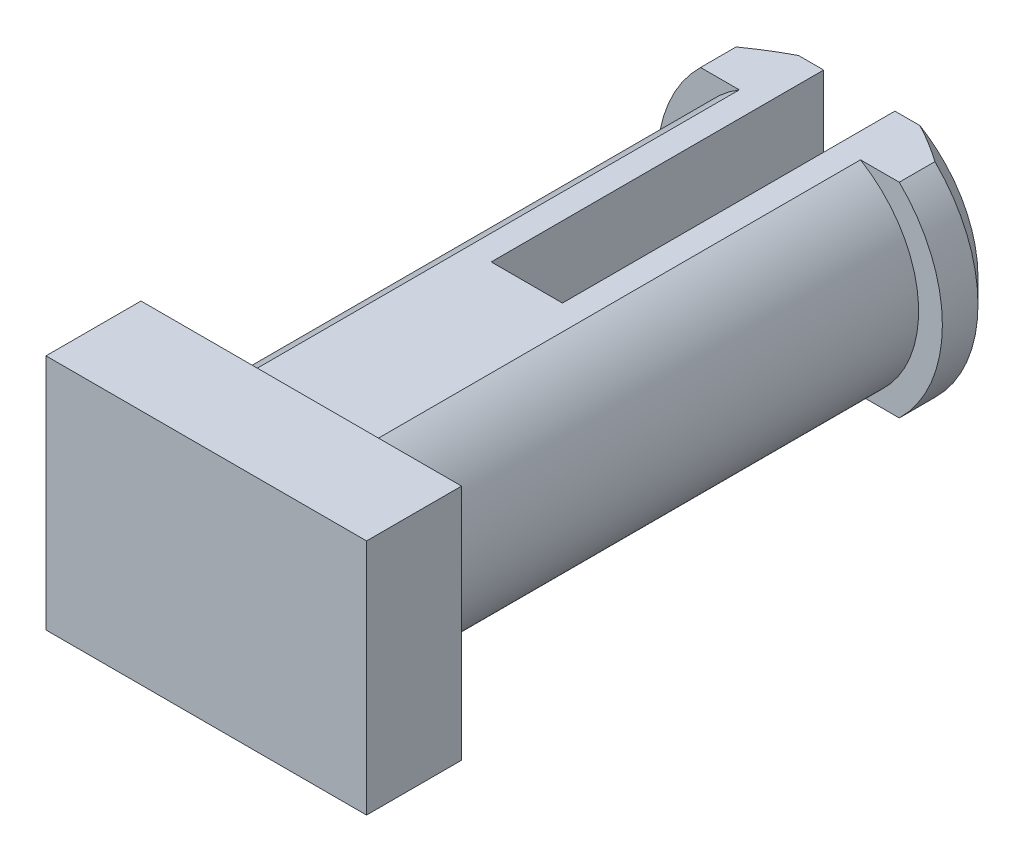
ISO-10303-21;
HEADER;
FILE_DESCRIPTION(('STEP AP214'),'2;1');
FILE_NAME('part.step','',(''),(''),'','','');
FILE_SCHEMA(('AUTOMOTIVE_DESIGN { 1 0 10303 214 1 1 1 1 }'));
ENDSEC;
DATA;
#1=APPLICATION_CONTEXT('core data for automotive mechanical design processes');
#2=APPLICATION_PROTOCOL_DEFINITION('international standard','automotive_design',2000,#1);
#3=PRODUCT_CONTEXT('',#1,'mechanical');
#4=PRODUCT('Part','Part','',(#3));
#5=PRODUCT_RELATED_PRODUCT_CATEGORY('part','',(#4));
#6=PRODUCT_DEFINITION_FORMATION('','',#4);
#7=PRODUCT_DEFINITION_CONTEXT('part definition',#1,'design');
#8=PRODUCT_DEFINITION('design','',#6,#7);
#9=PRODUCT_DEFINITION_SHAPE('','',#8);
#10=(LENGTH_UNIT() NAMED_UNIT(*) SI_UNIT(.MILLI.,.METRE.));
#11=(NAMED_UNIT(*) PLANE_ANGLE_UNIT() SI_UNIT($,.RADIAN.));
#12=(NAMED_UNIT(*) SI_UNIT($,.STERADIAN.) SOLID_ANGLE_UNIT());
#13=UNCERTAINTY_MEASURE_WITH_UNIT(LENGTH_MEASURE(1.E-05),#10,'distance_accuracy_value','');
#14=(GEOMETRIC_REPRESENTATION_CONTEXT(3) GLOBAL_UNCERTAINTY_ASSIGNED_CONTEXT((#13)) GLOBAL_UNIT_ASSIGNED_CONTEXT((#10,
#11,#12)) REPRESENTATION_CONTEXT('',''));
#15=CARTESIAN_POINT('',(0.,0.,0.));
#16=DIRECTION('',(0.,0.,1.));
#17=DIRECTION('',(1.,0.,0.));
#18=AXIS2_PLACEMENT_3D('',#15,#16,#17);
#19=CARTESIAN_POINT('',(-105.21853344578,-4.81752768715062,-14.553562098375));
#20=DIRECTION('',(0.,0.,1.));
#21=DIRECTION('',(1.,0.,0.));
#22=AXIS2_PLACEMENT_3D('',#19,#20,#21);
#23=PLANE('',#22);
#24=DIRECTION('',(0.,1.,0.));
#25=VECTOR('',#24,1.);
#26=CARTESIAN_POINT('',(-104.18353344578,1.90247231284937,-14.553562098375));
#27=LINE('',#26,#25);
#28=CARTESIAN_POINT('',(-104.18353344578,-3.95752768715062,-14.553562098375));
#29=VERTEX_POINT('',#28);
#30=CARTESIAN_POINT('',(-104.18353344578,1.04247231284938,-14.553562098375));
#31=VERTEX_POINT('',#30);
#32=EDGE_CURVE('E242',#29,#31,#27,.T.);
#33=ORIENTED_EDGE('',*,*,#32,.F.);
#34=DIRECTION('',(1.,0.,0.));
#35=VECTOR('',#34,1.);
#36=CARTESIAN_POINT('',(-105.21853344578,-3.95752768715061,-14.553562098375));
#37=LINE('',#36,#35);
#38=CARTESIAN_POINT('',(-97.4335334457796,-3.95752768715061,-14.553562098375));
#39=VERTEX_POINT('',#38);
#40=EDGE_CURVE('E245',#39,#29,#37,.F.);
#41=ORIENTED_EDGE('',*,*,#40,.F.);
#42=DIRECTION('',(0.,1.,0.));
#43=VECTOR('',#42,1.);
#44=CARTESIAN_POINT('',(-97.4335334457796,-4.81752768715061,-14.553562098375));
#45=LINE('',#44,#43);
#46=CARTESIAN_POINT('',(-97.4335334457796,1.04247231284938,-14.553562098375));
#47=VERTEX_POINT('',#46);
#48=EDGE_CURVE('E234',#47,#39,#45,.F.);
#49=ORIENTED_EDGE('',*,*,#48,.F.);
#50=DIRECTION('',(1.,0.,0.));
#51=VECTOR('',#50,1.);
#52=CARTESIAN_POINT('',(-105.21853344578,1.04247231284937,-14.553562098375));
#53=LINE('',#52,#51);
#54=EDGE_CURVE('E160',#31,#47,#53,.T.);
#55=ORIENTED_EDGE('',*,*,#54,.F.);
#56=EDGE_LOOP('',(#33,#41,#49,#55));
#57=FACE_BOUND('',#56,.T.);
#58=ADVANCED_FACE('F15',(#57),#23,.T.);
#59=CARTESIAN_POINT('',(-105.21853344578,-3.95752768715061,-13.993562098375));
#60=DIRECTION('',(0.,-1.,0.));
#61=DIRECTION('',(0.,0.,-1.));
#62=AXIS2_PLACEMENT_3D('',#59,#60,#61);
#63=PLANE('',#62);
#64=DIRECTION('',(-1.,0.,0.));
#65=VECTOR('',#64,1.);
#66=CARTESIAN_POINT('',(-96.3985334457796,-3.95752768715061,-16.553562098375));
#67=LINE('',#66,#65);
#68=CARTESIAN_POINT('',(-97.4335334457796,-3.95752768715061,-16.553562098375));
#69=VERTEX_POINT('',#68);
#70=CARTESIAN_POINT('',(-104.18353344578,-3.95752768715061,-16.553562098375));
#71=VERTEX_POINT('',#70);
#72=EDGE_CURVE('E179',#69,#71,#67,.T.);
#73=ORIENTED_EDGE('',*,*,#72,.F.);
#74=DIRECTION('',(0.,0.,-1.));
#75=VECTOR('',#74,1.);
#76=CARTESIAN_POINT('',(-97.4335334457796,-3.95752768715061,-17.113562098375));
#77=LINE('',#76,#75);
#78=EDGE_CURVE('E164',#39,#69,#77,.T.);
#79=ORIENTED_EDGE('',*,*,#78,.F.);
#80=ORIENTED_EDGE('',*,*,#40,.T.);
#81=DIRECTION('',(0.,0.,1.));
#82=VECTOR('',#81,1.);
#83=CARTESIAN_POINT('',(-104.18353344578,-3.95752768715062,-17.113562098375));
#84=LINE('',#83,#82);
#85=EDGE_CURVE('E239',#71,#29,#84,.T.);
#86=ORIENTED_EDGE('',*,*,#85,.F.);
#87=EDGE_LOOP('',(#73,#79,#80,#86));
#88=FACE_BOUND('',#87,.T.);
#89=ADVANCED_FACE('F516',(#88),#63,.T.);
#90=CARTESIAN_POINT('',(-104.18353344578,1.90247231284937,-17.113562098375));
#91=DIRECTION('',(-1.,0.,0.));
#92=DIRECTION('',(0.,0.,1.));
#93=AXIS2_PLACEMENT_3D('',#90,#91,#92);
#94=PLANE('',#93);
#95=DIRECTION('',(0.,1.,0.));
#96=VECTOR('',#95,1.);
#97=CARTESIAN_POINT('',(-104.18353344578,-4.81752768715062,-16.553562098375));
#98=LINE('',#97,#96);
#99=CARTESIAN_POINT('',(-104.18353344578,1.04247231284937,-16.553562098375));
#100=VERTEX_POINT('',#99);
#101=EDGE_CURVE('E177',#71,#100,#98,.T.);
#102=ORIENTED_EDGE('',*,*,#101,.F.);
#103=ORIENTED_EDGE('',*,*,#85,.T.);
#104=ORIENTED_EDGE('',*,*,#32,.T.);
#105=DIRECTION('',(0.,0.,1.));
#106=VECTOR('',#105,1.);
#107=CARTESIAN_POINT('',(-104.18353344578,1.04247231284937,-17.113562098375));
#108=LINE('',#107,#106);
#109=EDGE_CURVE('E236',#100,#31,#108,.T.);
#110=ORIENTED_EDGE('',*,*,#109,.F.);
#111=EDGE_LOOP('',(#102,#103,#104,#110));
#112=FACE_BOUND('',#111,.T.);
#113=ADVANCED_FACE('F509',(#112),#94,.T.);
#114=CARTESIAN_POINT('',(-105.21853344578,1.04247231284937,-17.113562098375));
#115=DIRECTION('',(0.,1.,0.));
#116=DIRECTION('',(0.,0.,1.));
#117=AXIS2_PLACEMENT_3D('',#114,#115,#116);
#118=PLANE('',#117);
#119=DIRECTION('',(-1.,0.,0.));
#120=VECTOR('',#119,1.);
#121=CARTESIAN_POINT('',(-96.3985334457796,1.04247231284937,-16.553562098375));
#122=LINE('',#121,#120);
#123=CARTESIAN_POINT('',(-97.4335334457796,1.04247231284937,-16.553562098375));
#124=VERTEX_POINT('',#123);
#125=EDGE_CURVE('E158',#100,#124,#122,.F.);
#126=ORIENTED_EDGE('',*,*,#125,.F.);
#127=ORIENTED_EDGE('',*,*,#109,.T.);
#128=ORIENTED_EDGE('',*,*,#54,.T.);
#129=DIRECTION('',(0.,0.,-1.));
#130=VECTOR('',#129,1.);
#131=CARTESIAN_POINT('',(-97.4335334457796,1.04247231284938,-17.113562098375));
#132=LINE('',#131,#130);
#133=EDGE_CURVE('E153',#124,#47,#132,.F.);
#134=ORIENTED_EDGE('',*,*,#133,.F.);
#135=EDGE_LOOP('',(#126,#127,#128,#134));
#136=FACE_BOUND('',#135,.T.);
#137=ADVANCED_FACE('F155',(#136),#118,.T.);
#138=CARTESIAN_POINT('',(-97.4335334457796,-4.81752768715061,-17.113562098375));
#139=DIRECTION('',(1.,0.,0.));
#140=DIRECTION('',(0.,0.,-1.));
#141=AXIS2_PLACEMENT_3D('',#138,#139,#140);
#142=PLANE('',#141);
#143=DIRECTION('',(0.,1.,0.));
#144=VECTOR('',#143,1.);
#145=CARTESIAN_POINT('',(-97.4335334457796,-4.81752768715062,-16.553562098375));
#146=LINE('',#145,#144);
#147=EDGE_CURVE('E168',#124,#69,#146,.F.);
#148=ORIENTED_EDGE('',*,*,#147,.F.);
#149=ORIENTED_EDGE('',*,*,#133,.T.);
#150=ORIENTED_EDGE('',*,*,#48,.T.);
#151=ORIENTED_EDGE('',*,*,#78,.T.);
#152=EDGE_LOOP('',(#148,#149,#150,#151));
#153=FACE_BOUND('',#152,.T.);
#154=ADVANCED_FACE('F169',(#153),#142,.T.);
#155=CARTESIAN_POINT('',(-100.80853344578,-1.45752768715064,-27.879762098375));
#156=DIRECTION('',(0.,0.,1.));
#157=DIRECTION('',(1.,0.,0.));
#158=AXIS2_PLACEMENT_3D('',#155,#156,#157);
#159=CYLINDRICAL_SURFACE('',#158,3.00000000000019);
#160=DIRECTION('',(0.,0.,-1.));
#161=VECTOR('',#160,1.);
#162=CARTESIAN_POINT('',(-102.90078104107,-3.60752768715061,-15.018562098375));
#163=LINE('',#162,#161);
#164=CARTESIAN_POINT('',(-102.900781041071,-3.60752768715061,-27.053562098375));
#165=VERTEX_POINT('',#164);
#166=CARTESIAN_POINT('',(-102.90078104107,-3.60752768715061,-27.8035620983753));
#167=VERTEX_POINT('',#166);
#168=EDGE_CURVE('E339',#165,#167,#163,.T.);
#169=ORIENTED_EDGE('',*,*,#168,.F.);
#170=CARTESIAN_POINT('',(-100.80853344578,-1.45752768715064,-27.053562098375));
#171=DIRECTION('',(0.,0.,1.));
#172=DIRECTION('',(1.,0.,0.));
#173=AXIS2_PLACEMENT_3D('',#170,#171,#172);
#174=CIRCLE('',#173,3.00000000000019);
#175=CARTESIAN_POINT('',(-102.900781041071,0.69247231284938,-27.053562098375));
#176=VERTEX_POINT('',#175);
#177=EDGE_CURVE('E330',#176,#165,#174,.T.);
#178=ORIENTED_EDGE('',*,*,#177,.F.);
#179=DIRECTION('',(0.,0.,1.));
#180=VECTOR('',#179,1.);
#181=CARTESIAN_POINT('',(-102.90078104107,0.692472312849348,-29.838562098375));
#182=LINE('',#181,#180);
#183=CARTESIAN_POINT('',(-102.90078104107,0.692472312849348,-27.8035620983753));
#184=VERTEX_POINT('',#183);
#185=EDGE_CURVE('E335',#184,#176,#182,.T.);
#186=ORIENTED_EDGE('',*,*,#185,.F.);
#187=CARTESIAN_POINT('',(-100.80853344578,-1.45752768715063,-27.8035620983753));
#188=DIRECTION('',(0.,0.,-1.));
#189=DIRECTION('',(-1.,0.,0.));
#190=AXIS2_PLACEMENT_3D('',#187,#188,#189);
#191=CIRCLE('',#190,2.99999999999996);
#192=EDGE_CURVE('E163',#167,#184,#191,.T.);
#193=ORIENTED_EDGE('',*,*,#192,.F.);
#194=EDGE_LOOP('',(#169,#178,#186,#193));
#195=FACE_BOUND('',#194,.T.);
#196=ADVANCED_FACE('F387',(#195),#159,.T.);
#197=CARTESIAN_POINT('',(-100.80853344578,-1.45752768715064,-30.803562098375));
#198=CARTESIAN_POINT('',(-100.80853344578,-4.75872768715063,-27.5023620983751));
#199=CARTESIAN_POINT('',(-100.80853344578,-1.45752768715064,-30.803562098375));
#200=CARTESIAN_POINT('',(-97.5073334457796,-4.75872768715063,-27.5023620983751));
#201=CARTESIAN_POINT('',(-100.80853344578,-1.45752768715064,-30.803562098375));
#202=CARTESIAN_POINT('',(-97.5073334457796,-1.45752768715064,-27.5023620983751));
#203=CARTESIAN_POINT('',(-100.80853344578,-1.45752768715064,-30.803562098375));
#204=CARTESIAN_POINT('',(-97.5073334457796,1.84367231284936,-27.5023620983751));
#205=CARTESIAN_POINT('',(-100.80853344578,-1.45752768715064,-30.803562098375));
#206=CARTESIAN_POINT('',(-100.80853344578,1.84367231284936,-27.5023620983751));
#207=CARTESIAN_POINT('',(-100.80853344578,-1.45752768715064,-30.803562098375));
#208=CARTESIAN_POINT('',(-104.10973344578,1.84367231284936,-27.5023620983751));
#209=CARTESIAN_POINT('',(-100.80853344578,-1.45752768715064,-30.803562098375));
#210=CARTESIAN_POINT('',(-104.10973344578,-1.45752768715064,-27.5023620983751));
#211=CARTESIAN_POINT('',(-100.80853344578,-1.45752768715064,-30.803562098375));
#212=CARTESIAN_POINT('',(-104.10973344578,-4.75872768715063,-27.5023620983751));
#213=CARTESIAN_POINT('',(-100.80853344578,-1.45752768715064,-30.803562098375));
#214=CARTESIAN_POINT('',(-100.80853344578,-4.75872768715063,-27.5023620983751));
#215=(BOUNDED_SURFACE() B_SPLINE_SURFACE(2,1,((#197,#198),(#199,#200),(#201,#202),(#203,#204),
(#205,#206),(#207,#208),(#209,#210),(#211,#212),(#213,#214)),.UNSPECIFIED.,.T.,.F.,
.F.) B_SPLINE_SURFACE_WITH_KNOTS((3,2,2,2,3),(2,2),(0.,1.5707963267949,3.14159265358979,
4.71238898038469,6.28318530717959),(0.,4.66860181210605),
.UNSPECIFIED.) GEOMETRIC_REPRESENTATION_ITEM() RATIONAL_B_SPLINE_SURFACE(((1.,1.),
(0.707106781186548,0.707106781186548),(1.,1.),(0.707106781186548,0.707106781186548),(1.,1.),
(0.707106781186548,0.707106781186548),(1.,1.),(0.707106781186548,0.707106781186548),(1.,1.))) REPRESENTATION_ITEM('') SURFACE());
#216=CARTESIAN_POINT('',(-102.084268527997,0.692472312849348,-28.3035620983752));
#217=CARTESIAN_POINT('',(-102.131731511163,0.692472312849352,-28.2793358630874));
#218=CARTESIAN_POINT('',(-102.17878857684,0.69247231284935,-28.2543292648226));
#219=CARTESIAN_POINT('',(-102.272101167892,0.692472312849346,-28.2029840635174));
#220=CARTESIAN_POINT('',(-102.318357550529,0.692472312849344,-28.1766470207928));
#221=CARTESIAN_POINT('',(-102.41016900958,0.692472312849352,-28.122824091318));
#222=CARTESIAN_POINT('',(-102.455724362794,0.692472312849361,-28.0953386748007));
#223=CARTESIAN_POINT('',(-102.546206950759,0.692472312849335,-28.0393722375522));
#224=CARTESIAN_POINT('',(-102.591134297498,0.692472312849301,-28.0108913975845));
#225=CARTESIAN_POINT('',(-102.680454131243,0.692472312849395,-27.953048621427));
#226=CARTESIAN_POINT('',(-102.724846289412,0.692472312849525,-27.9236861787228));
#227=CARTESIAN_POINT('',(-102.813162407772,0.692472312849171,-27.8641782151724));
#228=CARTESIAN_POINT('',(-102.857085899767,0.692472312848688,-27.8340319989069));
#229=CARTESIAN_POINT('',(-102.900781041069,0.69247231284751,-27.8035620983772));
#230=B_SPLINE_CURVE_WITH_KNOTS('',3,(#216,#217,#218,#219,#220,#221,#222,#223,#224,#225,#226,
#227,#228,#229),.UNSPECIFIED.,.F.,.F.,(4,2,2,2,2,2,4),(0.,0.159847893730926,0.319512487100147,
0.479112330199295,0.638683339885622,0.79834785295141,0.958159222297624),.UNSPECIFIED.);
#231=CARTESIAN_POINT('',(-102.084268527997,0.69247231284945,-28.3035620983751));
#232=VERTEX_POINT('',#231);
#233=EDGE_CURVE('E300',#232,#184,#230,.T.);
#234=CARTESIAN_POINT('',(-102.084268527997,-3.60752768715083,-28.303562098375));
#235=CARTESIAN_POINT('',(-102.144757375,-3.57163652985346,-28.303562098375));
#236=CARTESIAN_POINT('',(-102.203703300195,-3.53320615614647,-28.303562098375));
#237=CARTESIAN_POINT('',(-102.318144543892,-3.45152335957448,-28.303562098375));
#238=CARTESIAN_POINT('',(-102.373640213155,-3.40827142813122,-28.303562098375));
#239=CARTESIAN_POINT('',(-102.534253947415,-3.27179954390299,-28.303562098375));
#240=CARTESIAN_POINT('',(-102.633691608376,-3.17174877831358,-28.303562098375));
#241=CARTESIAN_POINT('',(-102.814382197606,-2.95630924557698,-28.303562098375));
#242=CARTESIAN_POINT('',(-102.895626615855,-2.84091334068696,-28.303562098375));
#243=CARTESIAN_POINT('',(-103.002037509735,-2.65898120985208,-28.303562098375));
#244=CARTESIAN_POINT('',(-103.034934623744,-2.59685679169187,-28.303562098375));
#245=CARTESIAN_POINT('',(-103.095417484003,-2.47000167806532,-28.303562098375));
#246=CARTESIAN_POINT('',(-103.122998167833,-2.40526856875453,-28.303562098375));
#247=CARTESIAN_POINT('',(-103.197360413274,-2.20800417801664,-28.303562098375));
#248=CARTESIAN_POINT('',(-103.235855152775,-2.07224849420567,-28.303562098375));
#249=CARTESIAN_POINT('',(-103.289477003512,-1.79618618073519,-28.303562098375));
#250=CARTESIAN_POINT('',(-103.30460265675,-1.65587926768193,-28.303562098375));
#251=CARTESIAN_POINT('',(-103.309495462302,-1.44509506499461,-28.303562098375));
#252=CARTESIAN_POINT('',(-103.308152527668,-1.37472526207422,-28.303562098375));
#253=CARTESIAN_POINT('',(-103.299547369717,-1.23441799668915,-28.303562098375));
#254=CARTESIAN_POINT('',(-103.2922923407,-1.16448011279558,-28.303562098375));
#255=CARTESIAN_POINT('',(-103.271918180028,-1.02547532873332,-28.303562098375));
#256=CARTESIAN_POINT('',(-103.258799993868,-0.956408289977464,-28.303562098375));
#257=CARTESIAN_POINT('',(-103.226784996657,-0.819554664387201,-28.303562098375));
#258=CARTESIAN_POINT('',(-103.207881156649,-0.751769742140739,-28.303562098375));
#259=CARTESIAN_POINT('',(-103.142712123785,-0.551262904973461,-28.303562098375));
#260=CARTESIAN_POINT('',(-103.087960888103,-0.42119556181977,-28.303562098375));
#261=CARTESIAN_POINT('',(-102.957375094802,-0.172129239211793,-28.303562098375));
#262=CARTESIAN_POINT('',(-102.881542463058,-0.0531292500323061,-28.303562098375));
#263=CARTESIAN_POINT('',(-102.75365863987,0.114560764321063,-28.303562098375));
#264=CARTESIAN_POINT('',(-102.708610685292,0.168715756011338,-28.303562098375));
#265=CARTESIAN_POINT('',(-102.614135522359,0.273004230182158,-28.303562098375));
#266=CARTESIAN_POINT('',(-102.564711959576,0.323140995338944,-28.303562098375));
#267=CARTESIAN_POINT('',(-102.461906368719,0.418982735055388,-28.303562098375));
#268=CARTESIAN_POINT('',(-102.408531260306,0.464695147736393,-28.303562098375));
#269=CARTESIAN_POINT('',(-102.298129583579,0.551459115158624,-28.303562098375));
#270=CARTESIAN_POINT('',(-102.241103864515,0.592511747797986,-28.303562098375));
#271=CARTESIAN_POINT('',(-102.150208260975,0.652307203832459,-28.303562098375));
#272=CARTESIAN_POINT('',(-102.11746468151,0.672776947143969,-28.303562098375));
#273=CARTESIAN_POINT('',(-102.084268527997,0.692472312849562,-28.303562098375));
#274=B_SPLINE_CURVE_WITH_KNOTS('',3,(#234,#235,#236,#237,#238,#239,#240,#241,#242,#243,#244,
#245,#246,#247,#248,#249,#250,#251,#252,#253,#254,#255,#256,#257,#258,#259,#260,#261,#262,#263,
#264,#265,#266,#267,#268,#269,#270,#271,#272,#273),.UNSPECIFIED.,.F.,.F.,(4,2,2,2,2,2,2,2,2,2,2,
2,2,2,2,2,2,2,2,4),(0.,0.210881807844334,0.421742141857395,0.842798226687727,1.2640508540075,
1.47472357751189,1.68559592775395,2.10679428465404,2.52801891906675,2.73895705114442,
2.94963887976355,3.16028674598819,3.37119154986919,3.79242227981352,4.21361454117864,
4.42473111522191,4.6356734219656,4.84625470224026,5.05678717125156,5.17258957882671),.UNSPECIFIED.);
#275=CARTESIAN_POINT('',(-102.084268527997,-3.60752768715072,-28.303562098375));
#276=VERTEX_POINT('',#275);
#277=EDGE_CURVE('E19',#276,#232,#274,.T.);
#278=CARTESIAN_POINT('',(-102.90078104107,-3.60752768715061,-27.8035620983755));
#279=CARTESIAN_POINT('',(-102.857085899769,-3.60752768715061,-27.8340319989055));
#280=CARTESIAN_POINT('',(-102.813162407773,-3.60752768715061,-27.8641782151713));
#281=CARTESIAN_POINT('',(-102.724846289413,-3.60752768715061,-27.9236861787219));
#282=CARTESIAN_POINT('',(-102.680454131244,-3.60752768715061,-27.9530486214261));
#283=CARTESIAN_POINT('',(-102.591134297499,-3.60752768715061,-28.0108913975837));
#284=CARTESIAN_POINT('',(-102.54620695076,-3.60752768715061,-28.0393722375515));
#285=CARTESIAN_POINT('',(-102.455724362795,-3.60752768715061,-28.0953386748002));
#286=CARTESIAN_POINT('',(-102.41016900958,-3.60752768715061,-28.1228240913176));
#287=CARTESIAN_POINT('',(-102.318357550529,-3.60752768715061,-28.1766470207925));
#288=CARTESIAN_POINT('',(-102.272101167893,-3.60752768715062,-28.2029840635172));
#289=CARTESIAN_POINT('',(-102.178788576841,-3.6075276871506,-28.2543292648225));
#290=CARTESIAN_POINT('',(-102.131731511163,-3.60752768715056,-28.2793358630874));
#291=CARTESIAN_POINT('',(-102.084268527997,-3.60752768715048,-28.3035620983752));
#292=B_SPLINE_CURVE_WITH_KNOTS('',3,(#278,#279,#280,#281,#282,#283,#284,#285,#286,#287,#288,
#289,#290,#291),.UNSPECIFIED.,.F.,.F.,(4,2,2,2,2,2,4),(0.,0.15981136934661,0.319475882412727,
0.479046892099443,0.638646735198969,0.798311328568551,0.958159222299843),.UNSPECIFIED.);
#293=EDGE_CURVE('E262',#167,#276,#292,.T.);
#294=ORIENTED_EDGE('',*,*,#233,.F.);
#295=ORIENTED_EDGE('',*,*,#277,.F.);
#296=ORIENTED_EDGE('',*,*,#293,.F.);
#297=ORIENTED_EDGE('',*,*,#192,.T.);
#298=EDGE_LOOP('',(#294,#295,#296,#297));
#299=FACE_BOUND('',#298,.T.);
#300=ADVANCED_FACE('F383',(#299),#215,.T.);
#301=CARTESIAN_POINT('',(-101.02353344578,-4.39752768715065,-28.303562098375));
#302=DIRECTION('',(0.,0.,-1.));
#303=DIRECTION('',(-1.,0.,0.));
#304=AXIS2_PLACEMENT_3D('',#301,#302,#303);
#305=PLANE('',#304);
#306=ORIENTED_EDGE('',*,*,#277,.T.);
#307=DIRECTION('',(1.,0.,0.));
#308=VECTOR('',#307,1.);
#309=CARTESIAN_POINT('',(-103.679230560128,0.692472312849348,-28.303562098375));
#310=LINE('',#309,#308);
#311=CARTESIAN_POINT('',(-101.55853344578,0.692472312849347,-28.303562098375));
#312=VERTEX_POINT('',#311);
#313=EDGE_CURVE('E222',#312,#232,#310,.F.);
#314=ORIENTED_EDGE('',*,*,#313,.F.);
#315=DIRECTION('',(0.,1.,0.));
#316=VECTOR('',#315,1.);
#317=CARTESIAN_POINT('',(-101.55853344578,-4.39752768715061,-28.303562098375));
#318=LINE('',#317,#316);
#319=CARTESIAN_POINT('',(-101.55853344578,-3.60752768715061,-28.303562098375));
#320=VERTEX_POINT('',#319);
#321=EDGE_CURVE('E107',#320,#312,#318,.T.);
#322=ORIENTED_EDGE('',*,*,#321,.F.);
#323=DIRECTION('',(1.,0.,0.));
#324=VECTOR('',#323,1.);
#325=CARTESIAN_POINT('',(-103.679230560128,-3.60752768715061,-28.303562098375));
#326=LINE('',#325,#324);
#327=EDGE_CURVE('E213',#276,#320,#326,.T.);
#328=ORIENTED_EDGE('',*,*,#327,.F.);
#329=EDGE_LOOP('',(#306,#314,#322,#328));
#330=FACE_BOUND('',#329,.T.);
#331=ADVANCED_FACE('F380',(#330),#305,.T.);
#332=CARTESIAN_POINT('',(-101.55853344578,-4.39752768715061,-29.363562098375));
#333=DIRECTION('',(1.,0.,0.));
#334=DIRECTION('',(0.,0.,-1.));
#335=AXIS2_PLACEMENT_3D('',#332,#333,#334);
#336=PLANE('',#335);
#337=DIRECTION('',(0.,0.,-1.));
#338=VECTOR('',#337,1.);
#339=CARTESIAN_POINT('',(-101.55853344578,-3.60752768715061,-15.018562098375));
#340=LINE('',#339,#338);
#341=CARTESIAN_POINT('',(-101.55853344578,-3.60752768715061,-21.303562098375));
#342=VERTEX_POINT('',#341);
#343=EDGE_CURVE('E209',#320,#342,#340,.F.);
#344=ORIENTED_EDGE('',*,*,#343,.F.);
#345=ORIENTED_EDGE('',*,*,#321,.T.);
#346=DIRECTION('',(0.,0.,1.));
#347=VECTOR('',#346,1.);
#348=CARTESIAN_POINT('',(-101.55853344578,0.692472312849348,-29.838562098375));
#349=LINE('',#348,#347);
#350=CARTESIAN_POINT('',(-101.55853344578,0.692472312849347,-21.303562098375));
#351=VERTEX_POINT('',#350);
#352=EDGE_CURVE('E219',#351,#312,#349,.F.);
#353=ORIENTED_EDGE('',*,*,#352,.F.);
#354=DIRECTION('',(0.,1.,0.));
#355=VECTOR('',#354,1.);
#356=CARTESIAN_POINT('',(-101.55853344578,-4.39752768715061,-21.303562098375));
#357=LINE('',#356,#355);
#358=EDGE_CURVE('E206',#342,#351,#357,.T.);
#359=ORIENTED_EDGE('',*,*,#358,.F.);
#360=EDGE_LOOP('',(#344,#345,#353,#359));
#361=FACE_BOUND('',#360,.T.);
#362=ADVANCED_FACE('F378',(#361),#336,.T.);
#363=CARTESIAN_POINT('',(-99.54853344578,-4.39752768715061,-21.303562098375));
#364=DIRECTION('',(0.,0.,-1.));
#365=DIRECTION('',(-1.,0.,0.));
#366=AXIS2_PLACEMENT_3D('',#363,#364,#365);
#367=PLANE('',#366);
#368=DIRECTION('',(1.,0.,0.));
#369=VECTOR('',#368,1.);
#370=CARTESIAN_POINT('',(-103.679230560128,0.692472312849348,-21.303562098375));
#371=LINE('',#370,#369);
#372=CARTESIAN_POINT('',(-100.05853344578,0.692472312849347,-21.303562098375));
#373=VERTEX_POINT('',#372);
#374=EDGE_CURVE('E223',#373,#351,#371,.F.);
#375=ORIENTED_EDGE('',*,*,#374,.F.);
#376=DIRECTION('',(0.,1.,0.));
#377=VECTOR('',#376,1.);
#378=CARTESIAN_POINT('',(-100.05853344578,1.48247231284934,-21.303562098375));
#379=LINE('',#378,#377);
#380=CARTESIAN_POINT('',(-100.05853344578,-3.60752768715061,-21.303562098375));
#381=VERTEX_POINT('',#380);
#382=EDGE_CURVE('E199',#381,#373,#379,.T.);
#383=ORIENTED_EDGE('',*,*,#382,.F.);
#384=DIRECTION('',(1.,0.,0.));
#385=VECTOR('',#384,1.);
#386=CARTESIAN_POINT('',(-103.679230560128,-3.60752768715061,-21.303562098375));
#387=LINE('',#386,#385);
#388=EDGE_CURVE('E204',#342,#381,#387,.T.);
#389=ORIENTED_EDGE('',*,*,#388,.F.);
#390=ORIENTED_EDGE('',*,*,#358,.T.);
#391=EDGE_LOOP('',(#375,#383,#389,#390));
#392=FACE_BOUND('',#391,.T.);
#393=ADVANCED_FACE('F375',(#392),#367,.T.);
#394=CARTESIAN_POINT('',(-100.05853344578,1.48247231284934,-29.363562098375));
#395=DIRECTION('',(-1.,0.,0.));
#396=DIRECTION('',(0.,0.,1.));
#397=AXIS2_PLACEMENT_3D('',#394,#395,#396);
#398=PLANE('',#397);
#399=DIRECTION('',(0.,0.,1.));
#400=VECTOR('',#399,1.);
#401=CARTESIAN_POINT('',(-100.05853344578,0.692472312849348,-29.838562098375));
#402=LINE('',#401,#400);
#403=CARTESIAN_POINT('',(-100.05853344578,0.692472312849347,-28.303562098375));
#404=VERTEX_POINT('',#403);
#405=EDGE_CURVE('E226',#404,#373,#402,.T.);
#406=ORIENTED_EDGE('',*,*,#405,.F.);
#407=DIRECTION('',(0.,1.,0.));
#408=VECTOR('',#407,1.);
#409=CARTESIAN_POINT('',(-100.05853344578,-4.39752768715061,-28.303562098375));
#410=LINE('',#409,#408);
#411=CARTESIAN_POINT('',(-100.05853344578,-3.60752768715061,-28.303562098375));
#412=VERTEX_POINT('',#411);
#413=EDGE_CURVE('E197',#412,#404,#410,.T.);
#414=ORIENTED_EDGE('',*,*,#413,.F.);
#415=DIRECTION('',(0.,0.,-1.));
#416=VECTOR('',#415,1.);
#417=CARTESIAN_POINT('',(-100.05853344578,-3.60752768715061,-15.018562098375));
#418=LINE('',#417,#416);
#419=EDGE_CURVE('E200',#381,#412,#418,.T.);
#420=ORIENTED_EDGE('',*,*,#419,.F.);
#421=ORIENTED_EDGE('',*,*,#382,.T.);
#422=EDGE_LOOP('',(#406,#414,#420,#421));
#423=FACE_BOUND('',#422,.T.);
#424=ADVANCED_FACE('F371',(#423),#398,.T.);
#425=CARTESIAN_POINT('',(-97.7735334457795,-4.39752768715061,-28.303562098375));
#426=DIRECTION('',(0.,0.,-1.));
#427=DIRECTION('',(-1.,0.,0.));
#428=AXIS2_PLACEMENT_3D('',#425,#426,#427);
#429=PLANE('',#428);
#430=CARTESIAN_POINT('',(-99.5327983635623,-3.60752768715058,-28.303562098375));
#431=CARTESIAN_POINT('',(-99.472309516559,-3.57163652985322,-28.303562098375));
#432=CARTESIAN_POINT('',(-99.4133635913647,-3.53320615614622,-28.303562098375));
#433=CARTESIAN_POINT('',(-99.2989223476671,-3.45152335957419,-28.303562098375));
#434=CARTESIAN_POINT('',(-99.243426678404,-3.4082714281309,-28.303562098375));
#435=CARTESIAN_POINT('',(-99.0828129441448,-3.2717995439026,-28.303562098375));
#436=CARTESIAN_POINT('',(-98.9833752831835,-3.1717487783132,-28.303562098375));
#437=CARTESIAN_POINT('',(-98.8026846939537,-2.95630924557657,-28.303562098375));
#438=CARTESIAN_POINT('',(-98.7214402757044,-2.84091334068652,-28.303562098375));
#439=CARTESIAN_POINT('',(-98.6150293818244,-2.65898120985157,-28.303562098375));
#440=CARTESIAN_POINT('',(-98.5821322678159,-2.59685679169134,-28.303562098375));
#441=CARTESIAN_POINT('',(-98.5216494075567,-2.47000167806477,-28.303562098375));
#442=CARTESIAN_POINT('',(-98.4940687237262,-2.40526856875399,-28.303562098375));
#443=CARTESIAN_POINT('',(-98.4197064782855,-2.2080041780161,-28.303562098375));
#444=CARTESIAN_POINT('',(-98.3812117387848,-2.07224849420511,-28.303562098375));
#445=CARTESIAN_POINT('',(-98.3275898880477,-1.79618618073461,-28.303562098375));
#446=CARTESIAN_POINT('',(-98.3124642348092,-1.65587926768135,-28.303562098375));
#447=CARTESIAN_POINT('',(-98.3075714292581,-1.44509506499404,-28.303562098375));
#448=CARTESIAN_POINT('',(-98.3089143638916,-1.37472526207366,-28.303562098375));
#449=CARTESIAN_POINT('',(-98.3175195218429,-1.2344179966886,-28.303562098375));
#450=CARTESIAN_POINT('',(-98.3247745508597,-1.16448011279505,-28.303562098375));
#451=CARTESIAN_POINT('',(-98.3451487115321,-1.02547532873282,-28.303562098375));
#452=CARTESIAN_POINT('',(-98.3582668976922,-0.956408289976974,-28.303562098375));
#453=CARTESIAN_POINT('',(-98.3902818949024,-0.819554664386735,-28.303562098375));
#454=CARTESIAN_POINT('',(-98.4091857349109,-0.751769742140283,-28.303562098375));
#455=CARTESIAN_POINT('',(-98.4743547677753,-0.551262904973044,-28.303562098375));
#456=CARTESIAN_POINT('',(-98.5291060034572,-0.421195561819386,-28.303562098375));
#457=CARTESIAN_POINT('',(-98.6596917967579,-0.172129239211468,-28.303562098375));
#458=CARTESIAN_POINT('',(-98.7355244285015,-0.0531292500320038,-28.303562098375));
#459=CARTESIAN_POINT('',(-98.8634082516903,0.114560764321311,-28.303562098375));
#460=CARTESIAN_POINT('',(-98.9084562062681,0.168715756011569,-28.303562098375));
#461=CARTESIAN_POINT('',(-99.0029313692012,0.273004230182356,-28.303562098375));
#462=CARTESIAN_POINT('',(-99.0523549319836,0.323140995339126,-28.303562098375));
#463=CARTESIAN_POINT('',(-99.1551605228407,0.418982735055569,-28.303562098375));
#464=CARTESIAN_POINT('',(-99.2085356312542,0.464695147736587,-28.303562098375));
#465=CARTESIAN_POINT('',(-99.3189373079815,0.551459115158799,-28.303562098375));
#466=CARTESIAN_POINT('',(-99.3759630270448,0.592511747798128,-28.303562098375));
#467=CARTESIAN_POINT('',(-99.4668586305852,0.652307203832446,-28.303562098375));
#468=CARTESIAN_POINT('',(-99.4996022100497,0.672776947143829,-28.303562098375));
#469=CARTESIAN_POINT('',(-99.5327983635623,0.692472312849318,-28.303562098375));
#470=B_SPLINE_CURVE_WITH_KNOTS('',3,(#430,#431,#432,#433,#434,#435,#436,#437,#438,#439,#440,
#441,#442,#443,#444,#445,#446,#447,#448,#449,#450,#451,#452,#453,#454,#455,#456,#457,#458,#459,
#460,#461,#462,#463,#464,#465,#466,#467,#468,#469),.UNSPECIFIED.,.F.,.F.,(4,2,2,2,2,2,2,2,2,2,2,
2,2,2,2,2,2,2,2,4),(0.,0.210881807844374,0.421742141857454,0.842798226687849,1.26405085400767,
1.47472357751208,1.68559592775416,2.10679428465424,2.52801891906695,2.73895705114459,
2.9496388797637,3.16028674598831,3.37119154986928,3.79242227981355,4.21361454117861,
4.42473111522188,4.63567342196556,4.84625470224024,5.05678717125154,5.17258957882594),.UNSPECIFIED.);
#471=CARTESIAN_POINT('',(-99.5327983635623,-3.60752768715059,-28.303562098375));
#472=VERTEX_POINT('',#471);
#473=CARTESIAN_POINT('',(-99.5327983635623,0.692472312849333,-28.303562098375));
#474=VERTEX_POINT('',#473);
#475=EDGE_CURVE('E196',#472,#474,#470,.T.);
#476=ORIENTED_EDGE('',*,*,#475,.F.);
#477=DIRECTION('',(1.,0.,0.));
#478=VECTOR('',#477,1.);
#479=CARTESIAN_POINT('',(-103.679230560128,-3.60752768715061,-28.303562098375));
#480=LINE('',#479,#478);
#481=EDGE_CURVE('E203',#412,#472,#480,.T.);
#482=ORIENTED_EDGE('',*,*,#481,.F.);
#483=ORIENTED_EDGE('',*,*,#413,.T.);
#484=DIRECTION('',(1.,0.,0.));
#485=VECTOR('',#484,1.);
#486=CARTESIAN_POINT('',(-103.679230560128,0.692472312849348,-28.303562098375));
#487=LINE('',#486,#485);
#488=EDGE_CURVE('E229',#474,#404,#487,.F.);
#489=ORIENTED_EDGE('',*,*,#488,.F.);
#490=EDGE_LOOP('',(#476,#482,#483,#489));
#491=FACE_BOUND('',#490,.T.);
#492=ADVANCED_FACE('F278',(#491),#429,.T.);
#493=CARTESIAN_POINT('',(-100.80853344578,-1.45752768715064,-30.803562098375));
#494=CARTESIAN_POINT('',(-100.80853344578,-4.75872768715063,-27.5023620983751));
#495=CARTESIAN_POINT('',(-100.80853344578,-1.45752768715064,-30.803562098375));
#496=CARTESIAN_POINT('',(-97.5073334457796,-4.75872768715063,-27.5023620983751));
#497=CARTESIAN_POINT('',(-100.80853344578,-1.45752768715064,-30.803562098375));
#498=CARTESIAN_POINT('',(-97.5073334457796,-1.45752768715064,-27.5023620983751));
#499=CARTESIAN_POINT('',(-100.80853344578,-1.45752768715064,-30.803562098375));
#500=CARTESIAN_POINT('',(-97.5073334457796,1.84367231284936,-27.5023620983751));
#501=CARTESIAN_POINT('',(-100.80853344578,-1.45752768715064,-30.803562098375));
#502=CARTESIAN_POINT('',(-100.80853344578,1.84367231284936,-27.5023620983751));
#503=CARTESIAN_POINT('',(-100.80853344578,-1.45752768715064,-30.803562098375));
#504=CARTESIAN_POINT('',(-104.10973344578,1.84367231284936,-27.5023620983751));
#505=CARTESIAN_POINT('',(-100.80853344578,-1.45752768715064,-30.803562098375));
#506=CARTESIAN_POINT('',(-104.10973344578,-1.45752768715064,-27.5023620983751));
#507=CARTESIAN_POINT('',(-100.80853344578,-1.45752768715064,-30.803562098375));
#508=CARTESIAN_POINT('',(-104.10973344578,-4.75872768715063,-27.5023620983751));
#509=CARTESIAN_POINT('',(-100.80853344578,-1.45752768715064,-30.803562098375));
#510=CARTESIAN_POINT('',(-100.80853344578,-4.75872768715063,-27.5023620983751));
#511=(BOUNDED_SURFACE() B_SPLINE_SURFACE(2,1,((#493,#494),(#495,#496),(#497,#498),(#499,#500),
(#501,#502),(#503,#504),(#505,#506),(#507,#508),(#509,#510)),.UNSPECIFIED.,.T.,.F.,
.F.) B_SPLINE_SURFACE_WITH_KNOTS((3,2,2,2,3),(2,2),(0.,1.5707963267949,3.14159265358979,
4.71238898038469,6.28318530717959),(0.,4.66860181210605),
.UNSPECIFIED.) GEOMETRIC_REPRESENTATION_ITEM() RATIONAL_B_SPLINE_SURFACE(((1.,1.),
(0.707106781186548,0.707106781186548),(1.,1.),(0.707106781186548,0.707106781186548),(1.,1.),
(0.707106781186548,0.707106781186548),(1.,1.),(0.707106781186548,0.707106781186548),(1.,1.))) REPRESENTATION_ITEM('') SURFACE());
#512=CARTESIAN_POINT('',(-99.5327983635623,-3.6075276871506,-28.303562098375));
#513=CARTESIAN_POINT('',(-99.4853353803962,-3.60752768715061,-28.2793358630872));
#514=CARTESIAN_POINT('',(-99.438278314719,-3.60752768715061,-28.2543292648224));
#515=CARTESIAN_POINT('',(-99.3449657236673,-3.60752768715061,-28.2029840635172));
#516=CARTESIAN_POINT('',(-99.2987093410308,-3.60752768715061,-28.1766470207925));
#517=CARTESIAN_POINT('',(-99.2068978819797,-3.60752768715061,-28.1228240913177));
#518=CARTESIAN_POINT('',(-99.1613425287652,-3.60752768715062,-28.0953386748004));
#519=CARTESIAN_POINT('',(-99.0708599408007,-3.6075276871506,-28.0393722375518));
#520=CARTESIAN_POINT('',(-99.0259325940612,-3.60752768715056,-28.0108913975841));
#521=CARTESIAN_POINT('',(-98.9366127603162,-3.60752768715066,-27.9530486214266));
#522=CARTESIAN_POINT('',(-98.8922206021472,-3.60752768715079,-27.9236861787224));
#523=CARTESIAN_POINT('',(-98.8039044837876,-3.60752768715043,-27.864178215172));
#524=CARTESIAN_POINT('',(-98.759980991792,-3.60752768714995,-27.8340319989064));
#525=CARTESIAN_POINT('',(-98.7162858504904,-3.60752768714877,-27.8035620983767));
#526=B_SPLINE_CURVE_WITH_KNOTS('',3,(#512,#513,#514,#515,#516,#517,#518,#519,#520,#521,#522,
#523,#524,#525),.UNSPECIFIED.,.F.,.F.,(4,2,2,2,2,2,4),(0.,0.159847893730992,0.319512487100291,
0.479112330199531,0.63868333988596,0.798347852951795,0.958159222298083),.UNSPECIFIED.);
#527=CARTESIAN_POINT('',(-98.7162858504889,-3.60752768715061,-27.803562098375));
#528=VERTEX_POINT('',#527);
#529=EDGE_CURVE('E254',#472,#528,#526,.T.);
#530=CARTESIAN_POINT('',(-98.7162858504889,0.692472312849368,-27.803562098375));
#531=CARTESIAN_POINT('',(-98.7599809917904,0.692472312849356,-27.8340319989051));
#532=CARTESIAN_POINT('',(-98.8039044837861,0.69247231284935,-27.8641782151709));
#533=CARTESIAN_POINT('',(-98.8922206021458,0.692472312849346,-27.9236861787215));
#534=CARTESIAN_POINT('',(-98.936612760315,0.692472312849347,-27.9530486214258));
#535=CARTESIAN_POINT('',(-99.0259325940601,0.692472312849349,-28.0108913975834));
#536=CARTESIAN_POINT('',(-99.0708599407997,0.692472312849349,-28.0393722375512));
#537=CARTESIAN_POINT('',(-99.1613425287644,0.692472312849347,-28.0953386747999));
#538=CARTESIAN_POINT('',(-99.206897881979,0.692472312849345,-28.1228240913173));
#539=CARTESIAN_POINT('',(-99.2987093410303,0.692472312849351,-28.1766470207922));
#540=CARTESIAN_POINT('',(-99.3449657236669,0.692472312849361,-28.2029840635169));
#541=CARTESIAN_POINT('',(-99.4382783147188,0.692472312849335,-28.2543292648223));
#542=CARTESIAN_POINT('',(-99.4853353803961,0.692472312849301,-28.2793358630872));
#543=CARTESIAN_POINT('',(-99.5327983635623,0.692472312849217,-28.303562098375));
#544=B_SPLINE_CURVE_WITH_KNOTS('',3,(#530,#531,#532,#533,#534,#535,#536,#537,#538,#539,#540,
#541,#542,#543),.UNSPECIFIED.,.F.,.F.,(4,2,2,2,2,2,4),(0.,0.159811369346671,0.319475882412902,
0.479046892099682,0.638646735199269,0.798311328568925,0.95815922230029),.UNSPECIFIED.);
#545=CARTESIAN_POINT('',(-98.7162858504889,0.692472312849358,-27.803562098375));
#546=VERTEX_POINT('',#545);
#547=EDGE_CURVE('E292',#546,#474,#544,.T.);
#548=CARTESIAN_POINT('',(-100.80853344578,-1.45752768715067,-27.803562098375));
#549=DIRECTION('',(0.,0.,1.));
#550=DIRECTION('',(0.,-1.,0.));
#551=AXIS2_PLACEMENT_3D('',#548,#549,#550);
#552=CIRCLE('',#551,3.00000000000018);
#553=EDGE_CURVE('E193',#528,#546,#552,.T.);
#554=ORIENTED_EDGE('',*,*,#529,.F.);
#555=ORIENTED_EDGE('',*,*,#475,.T.);
#556=ORIENTED_EDGE('',*,*,#547,.F.);
#557=ORIENTED_EDGE('',*,*,#553,.F.);
#558=EDGE_LOOP('',(#554,#555,#556,#557));
#559=FACE_BOUND('',#558,.T.);
#560=ADVANCED_FACE('F270',(#559),#511,.T.);
#561=CARTESIAN_POINT('',(-100.80853344578,-1.45752768715064,-27.879762098375));
#562=DIRECTION('',(0.,0.,1.));
#563=DIRECTION('',(1.,0.,0.));
#564=AXIS2_PLACEMENT_3D('',#561,#562,#563);
#565=CYLINDRICAL_SURFACE('',#564,3.00000000000019);
#566=DIRECTION('',(0.,0.,1.));
#567=VECTOR('',#566,1.);
#568=CARTESIAN_POINT('',(-98.7162858504889,0.692472312849348,-29.838562098375));
#569=LINE('',#568,#567);
#570=CARTESIAN_POINT('',(-98.7162858504889,0.692472312849348,-27.053562098375));
#571=VERTEX_POINT('',#570);
#572=EDGE_CURVE('E231',#571,#546,#569,.F.);
#573=ORIENTED_EDGE('',*,*,#572,.F.);
#574=CARTESIAN_POINT('',(-100.80853344578,-1.45752768715064,-27.053562098375));
#575=DIRECTION('',(0.,0.,1.));
#576=DIRECTION('',(1.,0.,0.));
#577=AXIS2_PLACEMENT_3D('',#574,#575,#576);
#578=CIRCLE('',#577,3.00000000000019);
#579=CARTESIAN_POINT('',(-98.7162858504889,-3.60752768715061,-27.053562098375));
#580=VERTEX_POINT('',#579);
#581=EDGE_CURVE('E195',#580,#571,#578,.T.);
#582=ORIENTED_EDGE('',*,*,#581,.F.);
#583=DIRECTION('',(0.,0.,-1.));
#584=VECTOR('',#583,1.);
#585=CARTESIAN_POINT('',(-98.7162858504889,-3.60752768715061,-15.018562098375));
#586=LINE('',#585,#584);
#587=EDGE_CURVE('E192',#528,#580,#586,.F.);
#588=ORIENTED_EDGE('',*,*,#587,.F.);
#589=ORIENTED_EDGE('',*,*,#553,.T.);
#590=EDGE_LOOP('',(#573,#582,#588,#589));
#591=FACE_BOUND('',#590,.T.);
#592=ADVANCED_FACE('F277',(#591),#565,.T.);
#593=CARTESIAN_POINT('',(-100.065224855341,-4.39752768715061,-27.053562098375));
#594=DIRECTION('',(0.,0.,1.));
#595=DIRECTION('',(1.,0.,0.));
#596=AXIS2_PLACEMENT_3D('',#593,#594,#595);
#597=PLANE('',#596);
#598=ORIENTED_EDGE('',*,*,#581,.T.);
#599=DIRECTION('',(1.,0.,0.));
#600=VECTOR('',#599,1.);
#601=CARTESIAN_POINT('',(-103.679230560128,0.692472312849348,-27.053562098375));
#602=LINE('',#601,#600);
#603=CARTESIAN_POINT('',(-99.5327983635623,0.692472312849348,-27.053562098375));
#604=VERTEX_POINT('',#603);
#605=EDGE_CURVE('E218',#604,#571,#602,.T.);
#606=ORIENTED_EDGE('',*,*,#605,.F.);
#607=CARTESIAN_POINT('',(-100.80853344578,-1.45752768715065,-27.053562098375));
#608=DIRECTION('',(0.,0.,1.));
#609=DIRECTION('',(1.,0.,0.));
#610=AXIS2_PLACEMENT_3D('',#607,#608,#609);
#611=CIRCLE('',#610,2.50000000000019);
#612=CARTESIAN_POINT('',(-99.5327983635623,-3.60752768715061,-27.053562098375));
#613=VERTEX_POINT('',#612);
#614=EDGE_CURVE('E184',#613,#604,#611,.T.);
#615=ORIENTED_EDGE('',*,*,#614,.F.);
#616=DIRECTION('',(1.,0.,0.));
#617=VECTOR('',#616,1.);
#618=CARTESIAN_POINT('',(-103.679230560128,-3.60752768715061,-27.053562098375));
#619=LINE('',#618,#617);
#620=EDGE_CURVE('E189',#580,#613,#619,.F.);
#621=ORIENTED_EDGE('',*,*,#620,.F.);
#622=EDGE_LOOP('',(#598,#606,#615,#621));
#623=FACE_BOUND('',#622,.T.);
#624=ADVANCED_FACE('F280',(#623),#597,.T.);
#625=CARTESIAN_POINT('',(-100.80853344578,-1.45752768715065,-28.1047620983749));
#626=DIRECTION('',(0.,0.,1.));
#627=DIRECTION('',(1.,0.,0.));
#628=AXIS2_PLACEMENT_3D('',#625,#626,#627);
#629=CYLINDRICAL_SURFACE('',#628,2.50000000000019);
#630=ORIENTED_EDGE('',*,*,#614,.T.);
#631=DIRECTION('',(0.,0.,1.));
#632=VECTOR('',#631,1.);
#633=CARTESIAN_POINT('',(-99.5327983635623,0.692472312849348,-29.838562098375));
#634=LINE('',#633,#632);
#635=CARTESIAN_POINT('',(-99.5327983635623,0.692472312849347,-16.553562098375));
#636=VERTEX_POINT('',#635);
#637=EDGE_CURVE('E173',#636,#604,#634,.F.);
#638=ORIENTED_EDGE('',*,*,#637,.F.);
#639=CARTESIAN_POINT('',(-100.80853344578,-1.45752768715065,-16.553562098375));
#640=DIRECTION('',(0.,0.,1.));
#641=DIRECTION('',(1.,0.,0.));
#642=AXIS2_PLACEMENT_3D('',#639,#640,#641);
#643=CIRCLE('',#642,2.50000000000019);
#644=CARTESIAN_POINT('',(-99.5327983635623,-3.6075276871506,-16.553562098375));
#645=VERTEX_POINT('',#644);
#646=EDGE_CURVE('E352',#636,#645,#643,.F.);
#647=ORIENTED_EDGE('',*,*,#646,.T.);
#648=DIRECTION('',(0.,0.,-1.));
#649=VECTOR('',#648,1.);
#650=CARTESIAN_POINT('',(-99.5327983635623,-3.60752768715061,-15.018562098375));
#651=LINE('',#650,#649);
#652=EDGE_CURVE('E185',#613,#645,#651,.F.);
#653=ORIENTED_EDGE('',*,*,#652,.F.);
#654=EDGE_LOOP('',(#630,#638,#647,#653));
#655=FACE_BOUND('',#654,.T.);
#656=ADVANCED_FACE('F312',(#655),#629,.T.);
#657=CARTESIAN_POINT('',(-101.544342036219,-4.39752768715065,-16.553562098375));
#658=DIRECTION('',(0.,0.,-1.));
#659=DIRECTION('',(-1.,0.,0.));
#660=AXIS2_PLACEMENT_3D('',#657,#658,#659);
#661=PLANE('',#660);
#662=ORIENTED_EDGE('',*,*,#646,.F.);
#663=DIRECTION('',(1.,0.,0.));
#664=VECTOR('',#663,1.);
#665=CARTESIAN_POINT('',(-103.679230560128,0.692472312849348,-16.553562098375));
#666=LINE('',#665,#664);
#667=CARTESIAN_POINT('',(-102.084268527997,0.692472312849432,-16.553562098375));
#668=VERTEX_POINT('',#667);
#669=EDGE_CURVE('E332',#668,#636,#666,.T.);
#670=ORIENTED_EDGE('',*,*,#669,.F.);
#671=CARTESIAN_POINT('',(-100.80853344578,-1.45752768715065,-16.553562098375));
#672=DIRECTION('',(0.,0.,1.));
#673=DIRECTION('',(1.,0.,0.));
#674=AXIS2_PLACEMENT_3D('',#671,#672,#673);
#675=CIRCLE('',#674,2.50000000000019);
#676=CARTESIAN_POINT('',(-102.084268527997,-3.60752768715064,-16.553562098375));
#677=VERTEX_POINT('',#676);
#678=EDGE_CURVE('E251',#677,#668,#675,.F.);
#679=ORIENTED_EDGE('',*,*,#678,.F.);
#680=DIRECTION('',(1.,0.,0.));
#681=VECTOR('',#680,1.);
#682=CARTESIAN_POINT('',(-103.679230560128,-3.60752768715061,-16.553562098375));
#683=LINE('',#682,#681);
#684=EDGE_CURVE('E188',#645,#677,#683,.F.);
#685=ORIENTED_EDGE('',*,*,#684,.F.);
#686=EDGE_LOOP('',(#662,#670,#679,#685));
#687=FACE_BOUND('',#686,.T.);
#688=ORIENTED_EDGE('',*,*,#125,.T.);
#689=ORIENTED_EDGE('',*,*,#147,.T.);
#690=ORIENTED_EDGE('',*,*,#72,.T.);
#691=ORIENTED_EDGE('',*,*,#101,.T.);
#692=EDGE_LOOP('',(#688,#689,#690,#691));
#693=FACE_BOUND('',#692,.T.);
#694=ADVANCED_FACE('F175',(#687,#693),#661,.T.);
#695=CARTESIAN_POINT('',(-103.679230560128,0.692472312849348,-29.838562098375));
#696=DIRECTION('',(0.,1.,0.));
#697=DIRECTION('',(0.,0.,1.));
#698=AXIS2_PLACEMENT_3D('',#695,#696,#697);
#699=PLANE('',#698);
#700=DIRECTION('',(0.,0.,-1.));
#701=VECTOR('',#700,1.);
#702=CARTESIAN_POINT('',(-102.084268527997,0.692472312849517,-21.803562098375));
#703=LINE('',#702,#701);
#704=CARTESIAN_POINT('',(-102.084268527997,0.692472312849464,-27.053562098375));
#705=VERTEX_POINT('',#704);
#706=EDGE_CURVE('E250',#668,#705,#703,.T.);
#707=ORIENTED_EDGE('',*,*,#706,.F.);
#708=ORIENTED_EDGE('',*,*,#669,.T.);
#709=ORIENTED_EDGE('',*,*,#637,.T.);
#710=ORIENTED_EDGE('',*,*,#605,.T.);
#711=ORIENTED_EDGE('',*,*,#572,.T.);
#712=ORIENTED_EDGE('',*,*,#547,.T.);
#713=ORIENTED_EDGE('',*,*,#488,.T.);
#714=ORIENTED_EDGE('',*,*,#405,.T.);
#715=ORIENTED_EDGE('',*,*,#374,.T.);
#716=ORIENTED_EDGE('',*,*,#352,.T.);
#717=ORIENTED_EDGE('',*,*,#313,.T.);
#718=ORIENTED_EDGE('',*,*,#233,.T.);
#719=ORIENTED_EDGE('',*,*,#185,.T.);
#720=DIRECTION('',(1.,0.,0.));
#721=VECTOR('',#720,1.);
#722=CARTESIAN_POINT('',(-104.340959937558,0.692472312849412,-27.053562098375));
#723=LINE('',#722,#721);
#724=EDGE_CURVE('E328',#705,#176,#723,.F.);
#725=ORIENTED_EDGE('',*,*,#724,.F.);
#726=EDGE_LOOP('',(#707,#708,#709,#710,#711,#712,#713,#714,#715,#716,#717,#718,#719,#725));
#727=FACE_BOUND('',#726,.T.);
#728=ADVANCED_FACE('F305',(#727),#699,.T.);
#729=CARTESIAN_POINT('',(-104.340959937558,-4.39752768715076,-27.053562098375));
#730=DIRECTION('',(0.,0.,1.));
#731=DIRECTION('',(1.,0.,0.));
#732=AXIS2_PLACEMENT_3D('',#729,#730,#731);
#733=PLANE('',#732);
#734=ORIENTED_EDGE('',*,*,#177,.T.);
#735=DIRECTION('',(1.,0.,0.));
#736=VECTOR('',#735,1.);
#737=CARTESIAN_POINT('',(-103.679230560128,-3.60752768715061,-27.053562098375));
#738=LINE('',#737,#736);
#739=CARTESIAN_POINT('',(-102.084268527997,-3.6075276871507,-27.053562098375));
#740=VERTEX_POINT('',#739);
#741=EDGE_CURVE('E39',#740,#165,#738,.F.);
#742=ORIENTED_EDGE('',*,*,#741,.F.);
#743=CARTESIAN_POINT('',(-100.80853344578,-1.45752768715065,-27.053562098375));
#744=DIRECTION('',(0.,0.,1.));
#745=DIRECTION('',(1.,0.,0.));
#746=AXIS2_PLACEMENT_3D('',#743,#744,#745);
#747=CIRCLE('',#746,2.50000000000019);
#748=EDGE_CURVE('E30',#705,#740,#747,.T.);
#749=ORIENTED_EDGE('',*,*,#748,.F.);
#750=ORIENTED_EDGE('',*,*,#724,.T.);
#751=EDGE_LOOP('',(#734,#742,#749,#750));
#752=FACE_BOUND('',#751,.T.);
#753=ADVANCED_FACE('F308',(#752),#733,.T.);
#754=CARTESIAN_POINT('',(-103.679230560128,-3.60752768715061,-15.018562098375));
#755=DIRECTION('',(0.,-1.,0.));
#756=DIRECTION('',(0.,0.,-1.));
#757=AXIS2_PLACEMENT_3D('',#754,#755,#756);
#758=PLANE('',#757);
#759=ORIENTED_EDGE('',*,*,#652,.T.);
#760=ORIENTED_EDGE('',*,*,#684,.T.);
#761=DIRECTION('',(0.,0.,1.));
#762=VECTOR('',#761,1.);
#763=CARTESIAN_POINT('',(-102.084268527997,-3.60752768715078,-21.803562098375));
#764=LINE('',#763,#762);
#765=EDGE_CURVE('E10',#740,#677,#764,.T.);
#766=ORIENTED_EDGE('',*,*,#765,.F.);
#767=ORIENTED_EDGE('',*,*,#741,.T.);
#768=ORIENTED_EDGE('',*,*,#168,.T.);
#769=ORIENTED_EDGE('',*,*,#293,.T.);
#770=ORIENTED_EDGE('',*,*,#327,.T.);
#771=ORIENTED_EDGE('',*,*,#343,.T.);
#772=ORIENTED_EDGE('',*,*,#388,.T.);
#773=ORIENTED_EDGE('',*,*,#419,.T.);
#774=ORIENTED_EDGE('',*,*,#481,.T.);
#775=ORIENTED_EDGE('',*,*,#529,.T.);
#776=ORIENTED_EDGE('',*,*,#587,.T.);
#777=ORIENTED_EDGE('',*,*,#620,.T.);
#778=EDGE_LOOP('',(#759,#760,#766,#767,#768,#769,#770,#771,#772,#773,#774,#775,#776,#777));
#779=FACE_BOUND('',#778,.T.);
#780=ADVANCED_FACE('F267',(#779),#758,.T.);
#781=CARTESIAN_POINT('',(-100.80853344578,-1.45752768715065,-28.1047620983749));
#782=DIRECTION('',(0.,0.,1.));
#783=DIRECTION('',(1.,0.,0.));
#784=AXIS2_PLACEMENT_3D('',#781,#782,#783);
#785=CYLINDRICAL_SURFACE('',#784,2.50000000000019);
#786=ORIENTED_EDGE('',*,*,#748,.T.);
#787=ORIENTED_EDGE('',*,*,#765,.T.);
#788=ORIENTED_EDGE('',*,*,#678,.T.);
#789=ORIENTED_EDGE('',*,*,#706,.T.);
#790=EDGE_LOOP('',(#786,#787,#788,#789));
#791=FACE_BOUND('',#790,.T.);
#792=ADVANCED_FACE('F17',(#791),#785,.T.);
#793=CLOSED_SHELL('',(#58,#89,#113,#137,#154,#196,#300,#331,#362,#393,#424,#492,#560,#592,#624,
#656,#694,#728,#753,#780,#792));
#794=MANIFOLD_SOLID_BREP('B1',#793);
#795=ADVANCED_BREP_SHAPE_REPRESENTATION('',(#18,#794),#14);
#796=SHAPE_DEFINITION_REPRESENTATION(#9,#795);
ENDSEC;
END-ISO-10303-21;
